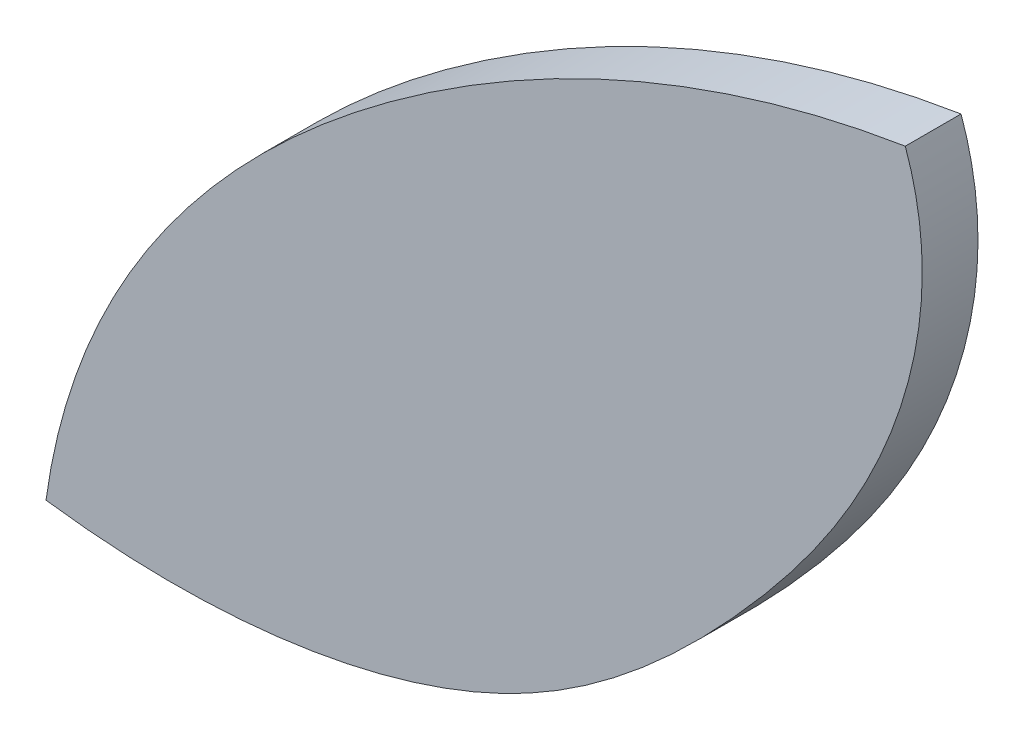
ISO-10303-21;
HEADER;
FILE_DESCRIPTION(('STEP AP214'),'2;1');
FILE_NAME('part.step','',(''),(''),'','','');
FILE_SCHEMA(('AUTOMOTIVE_DESIGN { 1 0 10303 214 1 1 1 1 }'));
ENDSEC;
DATA;
#1=APPLICATION_CONTEXT('core data for automotive mechanical design processes');
#2=APPLICATION_PROTOCOL_DEFINITION('international standard','automotive_design',2000,#1);
#3=PRODUCT_CONTEXT('',#1,'mechanical');
#4=PRODUCT('Part','Part','',(#3));
#5=PRODUCT_RELATED_PRODUCT_CATEGORY('part','',(#4));
#6=PRODUCT_DEFINITION_FORMATION('','',#4);
#7=PRODUCT_DEFINITION_CONTEXT('part definition',#1,'design');
#8=PRODUCT_DEFINITION('design','',#6,#7);
#9=PRODUCT_DEFINITION_SHAPE('','',#8);
#10=(LENGTH_UNIT() NAMED_UNIT(*) SI_UNIT(.MILLI.,.METRE.));
#11=(NAMED_UNIT(*) PLANE_ANGLE_UNIT() SI_UNIT($,.RADIAN.));
#12=(NAMED_UNIT(*) SI_UNIT($,.STERADIAN.) SOLID_ANGLE_UNIT());
#13=UNCERTAINTY_MEASURE_WITH_UNIT(LENGTH_MEASURE(1.E-05),#10,'distance_accuracy_value','');
#14=(GEOMETRIC_REPRESENTATION_CONTEXT(3) GLOBAL_UNCERTAINTY_ASSIGNED_CONTEXT((#13)) GLOBAL_UNIT_ASSIGNED_CONTEXT((#10,
#11,#12)) REPRESENTATION_CONTEXT('',''));
#15=CARTESIAN_POINT('',(0.,0.,0.));
#16=DIRECTION('',(0.,0.,1.));
#17=DIRECTION('',(1.,0.,0.));
#18=AXIS2_PLACEMENT_3D('',#15,#16,#17);
#19=CARTESIAN_POINT('',(32.8784199432722,8.94137853223743,3.));
#20=DIRECTION('',(0.,0.,1.));
#21=DIRECTION('',(1.,0.,0.));
#22=AXIS2_PLACEMENT_3D('',#19,#20,#21);
#23=PLANE('',#22);
#24=CARTESIAN_POINT('',(0.,0.,3.));
#25=CARTESIAN_POINT('',(0.329721398823703,-0.0449090701223305,3.));
#26=CARTESIAN_POINT('',(0.659892059524009,-0.0865615784518963,3.));
#27=CARTESIAN_POINT('',(1.32092617710751,-0.163347753709583,3.));
#28=CARTESIAN_POINT('',(1.65178948838158,-0.198482674058099,3.));
#29=CARTESIAN_POINT('',(2.31409814952873,-0.262242155846819,3.));
#30=CARTESIAN_POINT('',(2.64554343989444,-0.290867347822431,3.));
#31=CARTESIAN_POINT('',(3.98079719451141,-0.392989967614781,3.));
#32=CARTESIAN_POINT('',(4.98683363215821,-0.439953976317291,3.));
#33=CARTESIAN_POINT('',(6.62860333922785,-0.466978688323618,3.));
#34=CARTESIAN_POINT('',(7.2641248778094,-0.465320823546983,3.));
#35=CARTESIAN_POINT('',(8.53486832779002,-0.437240919557861,3.));
#36=CARTESIAN_POINT('',(9.17009007494591,-0.410810841291466,3.));
#37=CARTESIAN_POINT('',(10.4390792321248,-0.33250094341764,3.));
#38=CARTESIAN_POINT('',(11.0728463603468,-0.280616552192732,3.));
#39=CARTESIAN_POINT('',(12.3378171729051,-0.150571156260923,3.));
#40=CARTESIAN_POINT('',(12.9690203481776,-0.0724051690124423,3.));
#41=CARTESIAN_POINT('',(14.2236832060125,0.110586151220115,3.));
#42=CARTESIAN_POINT('',(14.8471666296933,0.215248094682774,3.));
#43=CARTESIAN_POINT('',(16.0887794337104,0.452476156408124,3.));
#44=CARTESIAN_POINT('',(16.706909186879,0.585040315011618,3.));
#45=CARTESIAN_POINT('',(17.9361156721882,0.879147257139047,3.));
#46=CARTESIAN_POINT('',(18.5471938563284,1.04068395731987,3.));
#47=CARTESIAN_POINT('',(19.7606184739435,1.39390894160029,3.));
#48=CARTESIAN_POINT('',(20.3629650467661,1.58559674393874,3.));
#49=CARTESIAN_POINT('',(21.3416517129101,1.92551777787347,3.));
#50=CARTESIAN_POINT('',(21.7212190628269,2.06451961632843,3.));
#51=CARTESIAN_POINT('',(22.4753229771006,2.35560687763814,3.));
#52=CARTESIAN_POINT('',(22.8498595018453,2.50769240344273,3.));
#53=CARTESIAN_POINT('',(23.5931553250064,2.8251686259992,3.));
#54=CARTESIAN_POINT('',(23.9619158541669,2.99055644093485,3.));
#55=CARTESIAN_POINT('',(24.6929492172135,3.33485558121848,3.));
#56=CARTESIAN_POINT('',(25.0552240255531,3.51376270120176,3.));
#57=CARTESIAN_POINT('',(25.5932348942131,3.79239619389367,3.));
#58=CARTESIAN_POINT('',(25.7716521117901,3.88697508642504,3.));
#59=CARTESIAN_POINT('',(26.1266063764534,4.07959729095361,3.));
#60=CARTESIAN_POINT('',(26.3031434283625,4.17764059406142,3.));
#61=CARTESIAN_POINT('',(26.8318246711186,4.47803013378673,3.));
#62=CARTESIAN_POINT('',(27.1810210688235,4.68559152637305,3.));
#63=CARTESIAN_POINT('',(27.8715365407776,5.1135615240998,3.));
#64=CARTESIAN_POINT('',(28.2128537530302,5.3339731234606,3.));
#65=CARTESIAN_POINT('',(28.8876384298116,5.78670154066834,3.));
#66=CARTESIAN_POINT('',(29.2211035247076,6.01902188683983,3.));
#67=CARTESIAN_POINT('',(29.8802186898772,6.49458346214352,3.));
#68=CARTESIAN_POINT('',(30.2058675796041,6.73782632526412,3.));
#69=CARTESIAN_POINT('',(30.8493934677067,7.2342305109507,3.));
#70=CARTESIAN_POINT('',(31.1672720174699,7.48738982694094,3.));
#71=CARTESIAN_POINT('',(31.9691775363834,8.14524049293005,3.));
#72=CARTESIAN_POINT('',(32.4479440839267,8.55635889109008,3.));
#73=CARTESIAN_POINT('',(33.3884438128382,9.39745750867571,3.));
#74=CARTESIAN_POINT('',(33.8501786285949,9.82743590955533,3.));
#75=CARTESIAN_POINT('',(34.758250987985,10.7039201560595,3.));
#76=CARTESIAN_POINT('',(35.2045781743001,11.1504367165036,3.));
#77=CARTESIAN_POINT('',(35.8635027900837,11.8307998582927,3.));
#78=CARTESIAN_POINT('',(36.0814863820246,12.0594656830959,3.));
#79=CARTESIAN_POINT('',(36.5140440865947,12.5200052103141,3.));
#80=CARTESIAN_POINT('',(36.7286181831514,12.7518789278415,3.));
#81=CARTESIAN_POINT('',(37.1547372817294,13.2187550100185,3.));
#82=CARTESIAN_POINT('',(37.3662795215749,13.4537598925699,3.));
#83=CARTESIAN_POINT('',(37.7862708579017,13.9265178583116,3.));
#84=CARTESIAN_POINT('',(37.9947199581027,14.1642709381964,3.));
#85=CARTESIAN_POINT('',(38.4077014535428,14.6422593603294,3.));
#86=CARTESIAN_POINT('',(38.6122413643395,14.8824881989933,3.));
#87=CARTESIAN_POINT('',(39.0175223293234,15.3661241949329,3.));
#88=CARTESIAN_POINT('',(39.2182633968506,15.6095313410426,3.));
#89=CARTESIAN_POINT('',(39.8139932083118,16.3445162701203,3.));
#90=CARTESIAN_POINT('',(40.2027629736879,16.8411735258313,3.));
#91=CARTESIAN_POINT('',(40.9600772674606,17.8487431123944,3.));
#92=CARTESIAN_POINT('',(41.3286465411886,18.3596367910262,3.));
#93=CARTESIAN_POINT('',(42.042275256388,19.3966906551616,3.));
#94=CARTESIAN_POINT('',(42.3873638183877,19.9228307327093,3.));
#95=CARTESIAN_POINT('',(43.0508188215521,20.9913658231556,3.));
#96=CARTESIAN_POINT('',(43.3692007737781,21.5337511489621,3.));
#97=CARTESIAN_POINT('',(43.8705079723053,22.4439042263714,3.));
#98=CARTESIAN_POINT('',(44.0620863313203,22.8069224287916,3.));
#99=CARTESIAN_POINT('',(44.431476875763,23.5400455984079,3.));
#100=CARTESIAN_POINT('',(44.6092851486755,23.9101525427515,3.));
#101=CARTESIAN_POINT('',(44.950155025113,24.657157692798,3.));
#102=CARTESIAN_POINT('',(45.1132148595835,25.034056706715,3.));
#103=CARTESIAN_POINT('',(45.4235970471842,25.794167375857,3.));
#104=CARTESIAN_POINT('',(45.5709238043048,26.1773772297073,3.));
#105=CARTESIAN_POINT('',(45.8487026200369,26.9498494315606,3.));
#106=CARTESIAN_POINT('',(45.9791562164101,27.3391112243835,3.));
#107=CARTESIAN_POINT('',(46.2218468892219,28.1232669273526,3.));
#108=CARTESIAN_POINT('',(46.3340838525335,28.5181608724586,3.));
#109=CARTESIAN_POINT('',(46.5921222785404,29.5200289577152,3.));
#110=CARTESIAN_POINT('',(46.7249918762546,30.1304182107155,3.));
#111=CARTESIAN_POINT('',(46.9389878095399,31.3604221743795,3.));
#112=CARTESIAN_POINT('',(47.0201030446397,31.9800388350286,3.));
#113=CARTESIAN_POINT('',(47.1234995197639,33.2220533592001,3.));
#114=CARTESIAN_POINT('',(47.1460121050631,33.8444305408228,3.));
#115=CARTESIAN_POINT('',(47.1311059724737,34.7768438809078,3.));
#116=CARTESIAN_POINT('',(47.1180326395876,35.0873909314233,3.));
#117=CARTESIAN_POINT('',(47.074929056446,35.7072854536637,3.));
#118=CARTESIAN_POINT('',(47.0449022879226,36.0166331585686,3.));
#119=CARTESIAN_POINT('',(46.9709186355546,36.6038760452394,3.));
#120=CARTESIAN_POINT('',(46.9285524893481,36.881972374944,3.));
#121=CARTESIAN_POINT('',(46.8290222077768,37.4354643069157,3.));
#122=CARTESIAN_POINT('',(46.7718607666849,37.7108603914396,3.));
#123=CARTESIAN_POINT('',(46.6422693196667,38.2589770825921,3.));
#124=CARTESIAN_POINT('',(46.5697909568622,38.5316862829677,3.));
#125=CARTESIAN_POINT('',(46.4095797774096,39.0727220970974,3.));
#126=CARTESIAN_POINT('',(46.3218398376965,39.3410466001154,3.));
#127=CARTESIAN_POINT('',(46.2264547117805,39.606646876841,3.));
#128=B_SPLINE_CURVE_WITH_KNOTS('',3,(#24,#25,#26,#27,#28,#29,#30,#31,#32,#33,#34,#35,#36,#37,
#38,#39,#40,#41,#42,#43,#44,#45,#46,#47,#48,#49,#50,#51,#52,#53,#54,#55,#56,#57,#58,#59,#60,#61,
#62,#63,#64,#65,#66,#67,#68,#69,#70,#71,#72,#73,#74,#75,#76,#77,#78,#79,#80,#81,#82,#83,#84,#85,
#86,#87,#88,#89,#90,#91,#92,#93,#94,#95,#96,#97,#98,#99,#100,#101,#102,#103,#104,#105,#106,#107,
#108,#109,#110,#111,#112,#113,#114,#115,#116,#117,#118,#119,#120,#121,#122,#123,#124,#125,#126,
#127),.UNSPECIFIED.,.F.,.F.,(4,2,2,2,2,2,2,2,2,2,2,2,2,2,2,2,2,2,2,2,2,2,2,2,2,2,2,2,2,2,2,2,2,
2,2,2,2,2,2,2,2,2,2,2,2,2,2,2,2,2,2,4),(0.,0.998292461984959,1.99639273932883,2.9943962989862,
6.01361712872947,7.9197956775692,9.82659303182036,11.7337329740299,13.6412346814472,
15.537248564064,17.4331293281464,19.3286124805797,21.2240653496288,22.4365081967404,
23.6489605849095,24.8611510104913,26.0729659076698,26.6787388206692,27.2845101794197,
28.5028645989847,29.7215040502135,30.9405066707877,32.1596922634354,33.3786324178063,
35.2711884921317,37.1635624791692,39.057184722169,40.0049149275432,40.9526495992392,
41.9011988919468,42.8497470438652,43.7962375158912,44.7427246636259,46.6344440424713,
48.523791772142,50.4107519552317,52.2966085018866,53.5277573531523,54.7592547388726,
55.9908996456361,57.2221988826421,58.4533858240996,59.6845804110584,61.5565366785186,
63.428894315378,65.2938491706299,66.2259338213185,67.1578271190929,68.0013621664436,
68.844743711167,69.6908287630049,70.5373097745734),.UNSPECIFIED.);
#129=CARTESIAN_POINT('',(0.,0.,3.));
#130=VERTEX_POINT('',#129);
#131=CARTESIAN_POINT('',(46.2264547117805,39.606646876841,3.));
#132=VERTEX_POINT('',#131);
#133=EDGE_CURVE('E24',#130,#132,#128,.T.);
#134=ORIENTED_EDGE('',*,*,#133,.T.);
#135=CARTESIAN_POINT('',(46.2264547117805,39.606646876841,3.));
#136=CARTESIAN_POINT('',(45.2380979423368,39.4477753558703,3.));
#137=CARTESIAN_POINT('',(44.2538523905631,39.2638145971802,3.));
#138=CARTESIAN_POINT('',(42.2944163568184,38.8467947062856,3.));
#139=CARTESIAN_POINT('',(41.3192399503758,38.6136693884776,3.));
#140=CARTESIAN_POINT('',(39.2031140987165,38.0525458355541,3.));
#141=CARTESIAN_POINT('',(38.0646930212978,37.7149829688989,3.));
#142=CARTESIAN_POINT('',(35.8082607836834,36.9754322350637,3.));
#143=CARTESIAN_POINT('',(34.6902623871255,36.5734055174076,3.));
#144=CARTESIAN_POINT('',(32.4782078734721,35.7075341459084,3.));
#145=CARTESIAN_POINT('',(31.3841570071182,35.2436760898886,3.));
#146=CARTESIAN_POINT('',(29.2224415359819,34.2564960980094,3.));
#147=CARTESIAN_POINT('',(28.1547932821353,33.7331383843509,3.));
#148=CARTESIAN_POINT('',(26.0494782990441,32.6298977466583,3.));
#149=CARTESIAN_POINT('',(25.0118044812559,32.050028331114,3.));
#150=CARTESIAN_POINT('',(22.9688816140578,30.8363307203649,3.));
#151=CARTESIAN_POINT('',(21.9636227381766,30.2025190936723,3.));
#152=CARTESIAN_POINT('',(20.4888669022475,29.2179135218987,3.));
#153=CARTESIAN_POINT('',(20.0062357754575,28.8866219046333,3.));
#154=CARTESIAN_POINT('',(19.0496646658213,28.211877775782,3.));
#155=CARTESIAN_POINT('',(18.5757230724857,27.8684275529323,3.));
#156=CARTESIAN_POINT('',(17.6371240225869,27.169145792449,3.));
#157=CARTESIAN_POINT('',(17.1724657740981,26.8133153180864,3.));
#158=CARTESIAN_POINT('',(16.2527540421677,26.0886244940665,3.));
#159=CARTESIAN_POINT('',(15.7977093418967,25.7197529880192,3.));
#160=CARTESIAN_POINT('',(14.8984361324613,24.9689608195061,3.));
#161=CARTESIAN_POINT('',(14.4542085354256,24.5870390630871,3.));
#162=CARTESIAN_POINT('',(13.5774481712487,23.8098244962485,3.));
#163=CARTESIAN_POINT('',(13.1449178969818,23.4145288754392,3.));
#164=CARTESIAN_POINT('',(12.0690283481005,22.3993806417666,3.));
#165=CARTESIAN_POINT('',(11.4341117651536,21.770519887174,3.));
#166=CARTESIAN_POINT('',(10.1978655200938,20.480355914255,3.));
#167=CARTESIAN_POINT('',(9.59654154455147,19.8190472385056,3.));
#168=CARTESIAN_POINT('',(8.43191331665501,18.4633939729221,3.));
#169=CARTESIAN_POINT('',(7.86861787100294,17.7690417938669,3.));
#170=CARTESIAN_POINT('',(6.78709896308569,16.349945913478,3.));
#171=CARTESIAN_POINT('',(6.2687200037777,15.6253210850277,3.));
#172=CARTESIAN_POINT('',(5.28009288340769,14.1440528309753,3.));
#173=CARTESIAN_POINT('',(4.8098363091265,13.3874150349955,3.));
#174=CARTESIAN_POINT('',(3.92294760809362,11.8436878399689,3.));
#175=CARTESIAN_POINT('',(3.50628791133244,11.0566143701046,3.));
#176=CARTESIAN_POINT('',(2.85976119237402,9.71922992065385,3.));
#177=CARTESIAN_POINT('',(2.61369019132497,9.17670242842462,3.));
#178=CARTESIAN_POINT('',(2.14927446289202,8.07997763381344,3.));
#179=CARTESIAN_POINT('',(1.93092493942214,7.52578236946533,3.));
#180=CARTESIAN_POINT('',(1.52325322452505,6.40692323175544,3.));
#181=CARTESIAN_POINT('',(1.33392574126036,5.84226128797081,3.));
#182=CARTESIAN_POINT('',(0.983882019399969,4.69900762511437,3.));
#183=CARTESIAN_POINT('',(0.823416174200643,4.12033920608469,3.));
#184=CARTESIAN_POINT('',(0.53383610665214,2.95500845590577,3.));
#185=CARTESIAN_POINT('',(0.40473031100924,2.36834402078627,3.));
#186=CARTESIAN_POINT('',(0.234986129548311,1.48360811657343,3.));
#187=CARTESIAN_POINT('',(0.18237439527519,1.18778818285362,3.));
#188=CARTESIAN_POINT('',(0.0851689009007837,0.594832968071263,3.));
#189=CARTESIAN_POINT('',(0.0405751638307364,0.297697683232959,3.));
#190=CARTESIAN_POINT('',(0.,0.,3.));
#191=B_SPLINE_CURVE_WITH_KNOTS('',3,(#135,#136,#137,#138,#139,#140,#141,#142,#143,#144,#145,
#146,#147,#148,#149,#150,#151,#152,#153,#154,#155,#156,#157,#158,#159,#160,#161,#162,#163,#164,
#165,#166,#167,#168,#169,#170,#171,#172,#173,#174,#175,#176,#177,#178,#179,#180,#181,#182,#183,
#184,#185,#186,#187,#188,#189,#190),.UNSPECIFIED.,.F.,.F.,(4,2,2,2,2,2,2,2,2,2,2,2,2,2,2,2,2,2,
2,2,2,2,2,2,2,2,2,4),(0.,3.0026824877662,6.00943330532942,9.56966029290925,13.1320410458126,
16.6951952176598,20.2605034001031,23.8249614162112,27.3883285225083,29.1443589140129,
30.9000604898725,32.6556116486969,34.4127028318652,36.1699416684446,37.9275520939946,
40.6072702045681,43.2874405728718,45.9682295047778,48.6393324131179,51.3099675327975,
53.9792233481533,55.7657136768365,57.5518945028545,59.3377492507997,61.1384196920608,
62.9395734545168,63.8408644767897,64.7421580879282),.UNSPECIFIED.);
#192=EDGE_CURVE('E54',#132,#130,#191,.T.);
#193=ORIENTED_EDGE('',*,*,#192,.T.);
#194=EDGE_LOOP('',(#134,#193));
#195=FACE_BOUND('',#194,.T.);
#196=ADVANCED_FACE('F17',(#195),#23,.T.);
#197=CARTESIAN_POINT('',(0.,0.,3.));
#198=CARTESIAN_POINT('',(0.,0.,0.));
#199=CARTESIAN_POINT('',(8.68950239891513,-1.18362191208477,3.));
#200=CARTESIAN_POINT('',(8.68950239891513,-1.18362191208477,0.));
#201=CARTESIAN_POINT('',(23.7506501852725,0.330471541162859,3.));
#202=CARTESIAN_POINT('',(23.7506501852725,0.330471541162859,0.));
#203=CARTESIAN_POINT('',(37.6438343672278,13.058756394492,3.));
#204=CARTESIAN_POINT('',(37.6438343672278,13.058756394492,0.));
#205=CARTESIAN_POINT('',(46.2538933961237,24.7966842191075,3.));
#206=CARTESIAN_POINT('',(46.2538933961237,24.7966842191075,0.));
#207=CARTESIAN_POINT('',(47.934931795003,34.8478222939048,3.));
#208=CARTESIAN_POINT('',(47.934931795003,34.8478222939048,0.));
#209=CARTESIAN_POINT('',(46.2264547117805,39.606646876841,3.));
#210=CARTESIAN_POINT('',(46.2264547117805,39.606646876841,0.));
#211=B_SPLINE_SURFACE_WITH_KNOTS('',3,1,((#197,#198),(#199,#200),(#201,#202),(#203,#204),(#205,
#206),(#207,#208),(#209,#210)),.UNSPECIFIED.,.F.,.F.,.F.,(4,1,1,1,4),(2,2),(0.,
0.383387059858794,0.59213823907144,0.788086285039639,1.),(0.,1.),.UNSPECIFIED.);
#212=DIRECTION('',(0.,0.,-1.));
#213=VECTOR('',#212,1.);
#214=CARTESIAN_POINT('',(0.,0.,1.5));
#215=LINE('',#214,#213);
#216=CARTESIAN_POINT('',(0.,0.,0.));
#217=VERTEX_POINT('',#216);
#218=EDGE_CURVE('E55',#130,#217,#215,.T.);
#219=CARTESIAN_POINT('',(0.,0.,0.));
#220=CARTESIAN_POINT('',(0.329721398823703,-0.0449090701223305,0.));
#221=CARTESIAN_POINT('',(0.659892059524009,-0.0865615784518963,0.));
#222=CARTESIAN_POINT('',(1.32092617710751,-0.163347753709583,0.));
#223=CARTESIAN_POINT('',(1.65178948838158,-0.198482674058099,0.));
#224=CARTESIAN_POINT('',(2.31409814952873,-0.262242155846819,0.));
#225=CARTESIAN_POINT('',(2.64554343989444,-0.290867347822431,0.));
#226=CARTESIAN_POINT('',(3.98079719451141,-0.392989967614781,0.));
#227=CARTESIAN_POINT('',(4.98683363215821,-0.439953976317291,0.));
#228=CARTESIAN_POINT('',(6.62860333922785,-0.466978688323618,0.));
#229=CARTESIAN_POINT('',(7.2641248778094,-0.465320823546983,0.));
#230=CARTESIAN_POINT('',(8.53486832779002,-0.437240919557861,0.));
#231=CARTESIAN_POINT('',(9.17009007494591,-0.410810841291466,0.));
#232=CARTESIAN_POINT('',(10.4390792321248,-0.33250094341764,0.));
#233=CARTESIAN_POINT('',(11.0728463603468,-0.280616552192732,0.));
#234=CARTESIAN_POINT('',(12.3378171729051,-0.150571156260923,0.));
#235=CARTESIAN_POINT('',(12.9690203481776,-0.0724051690124421,0.));
#236=CARTESIAN_POINT('',(14.2236832060125,0.110586151220115,0.));
#237=CARTESIAN_POINT('',(14.8471666296933,0.215248094682773,0.));
#238=CARTESIAN_POINT('',(16.0887794337104,0.452476156408123,0.));
#239=CARTESIAN_POINT('',(16.706909186879,0.585040315011617,0.));
#240=CARTESIAN_POINT('',(17.9361156721882,0.879147257139047,0.));
#241=CARTESIAN_POINT('',(18.5471938563284,1.04068395731987,0.));
#242=CARTESIAN_POINT('',(19.7606184739435,1.39390894160029,0.));
#243=CARTESIAN_POINT('',(20.3629650467661,1.58559674393874,0.));
#244=CARTESIAN_POINT('',(21.3416517129101,1.92551777787347,0.));
#245=CARTESIAN_POINT('',(21.7212190628269,2.06451961632843,0.));
#246=CARTESIAN_POINT('',(22.4753229771006,2.35560687763814,0.));
#247=CARTESIAN_POINT('',(22.8498595018453,2.50769240344272,0.));
#248=CARTESIAN_POINT('',(23.5931553250064,2.8251686259992,0.));
#249=CARTESIAN_POINT('',(23.9619158541669,2.99055644093484,0.));
#250=CARTESIAN_POINT('',(24.6929492172135,3.33485558121848,0.));
#251=CARTESIAN_POINT('',(25.0552240255531,3.51376270120176,0.));
#252=CARTESIAN_POINT('',(25.5932348942131,3.79239619389367,0.));
#253=CARTESIAN_POINT('',(25.7716521117901,3.88697508642504,0.));
#254=CARTESIAN_POINT('',(26.1266063764534,4.0795972909536,0.));
#255=CARTESIAN_POINT('',(26.3031434283625,4.17764059406142,0.));
#256=CARTESIAN_POINT('',(26.8318246711186,4.47803013378673,0.));
#257=CARTESIAN_POINT('',(27.1810210688235,4.68559152637305,0.));
#258=CARTESIAN_POINT('',(27.8715365407776,5.1135615240998,0.));
#259=CARTESIAN_POINT('',(28.2128537530302,5.3339731234606,0.));
#260=CARTESIAN_POINT('',(28.8876384298116,5.78670154066834,0.));
#261=CARTESIAN_POINT('',(29.2211035247076,6.01902188683983,0.));
#262=CARTESIAN_POINT('',(29.8802186898772,6.49458346214352,0.));
#263=CARTESIAN_POINT('',(30.2058675796041,6.73782632526412,0.));
#264=CARTESIAN_POINT('',(30.8493934677067,7.2342305109507,0.));
#265=CARTESIAN_POINT('',(31.1672720174699,7.48738982694094,0.));
#266=CARTESIAN_POINT('',(31.9691775363834,8.14524049293005,0.));
#267=CARTESIAN_POINT('',(32.4479440839267,8.55635889109008,0.));
#268=CARTESIAN_POINT('',(33.3884438128382,9.39745750867571,0.));
#269=CARTESIAN_POINT('',(33.8501786285949,9.82743590955532,0.));
#270=CARTESIAN_POINT('',(34.758250987985,10.7039201560595,0.));
#271=CARTESIAN_POINT('',(35.2045781743001,11.1504367165036,0.));
#272=CARTESIAN_POINT('',(35.8635027900837,11.8307998582927,0.));
#273=CARTESIAN_POINT('',(36.0814863820246,12.0594656830959,0.));
#274=CARTESIAN_POINT('',(36.5140440865947,12.5200052103141,0.));
#275=CARTESIAN_POINT('',(36.7286181831514,12.7518789278415,0.));
#276=CARTESIAN_POINT('',(37.1547372817294,13.2187550100185,0.));
#277=CARTESIAN_POINT('',(37.3662795215749,13.4537598925699,0.));
#278=CARTESIAN_POINT('',(37.7862708579017,13.9265178583116,0.));
#279=CARTESIAN_POINT('',(37.9947199581027,14.1642709381964,0.));
#280=CARTESIAN_POINT('',(38.4077014535428,14.6422593603294,0.));
#281=CARTESIAN_POINT('',(38.6122413643395,14.8824881989933,0.));
#282=CARTESIAN_POINT('',(39.0175223293234,15.3661241949329,0.));
#283=CARTESIAN_POINT('',(39.2182633968506,15.6095313410426,0.));
#284=CARTESIAN_POINT('',(39.8139932083118,16.3445162701203,0.));
#285=CARTESIAN_POINT('',(40.2027629736879,16.8411735258313,0.));
#286=CARTESIAN_POINT('',(40.9600772674606,17.8487431123944,0.));
#287=CARTESIAN_POINT('',(41.3286465411886,18.3596367910262,0.));
#288=CARTESIAN_POINT('',(42.042275256388,19.3966906551616,0.));
#289=CARTESIAN_POINT('',(42.3873638183877,19.9228307327093,0.));
#290=CARTESIAN_POINT('',(43.0508188215521,20.9913658231556,0.));
#291=CARTESIAN_POINT('',(43.3692007737781,21.5337511489621,0.));
#292=CARTESIAN_POINT('',(43.8705079723053,22.4439042263714,0.));
#293=CARTESIAN_POINT('',(44.0620863313203,22.8069224287916,0.));
#294=CARTESIAN_POINT('',(44.431476875763,23.5400455984079,0.));
#295=CARTESIAN_POINT('',(44.6092851486755,23.9101525427515,0.));
#296=CARTESIAN_POINT('',(44.950155025113,24.657157692798,0.));
#297=CARTESIAN_POINT('',(45.1132148595835,25.034056706715,0.));
#298=CARTESIAN_POINT('',(45.4235970471842,25.794167375857,0.));
#299=CARTESIAN_POINT('',(45.5709238043048,26.1773772297074,0.));
#300=CARTESIAN_POINT('',(45.8487026200369,26.9498494315606,0.));
#301=CARTESIAN_POINT('',(45.9791562164101,27.3391112243835,0.));
#302=CARTESIAN_POINT('',(46.2218468892219,28.1232669273526,0.));
#303=CARTESIAN_POINT('',(46.3340838525335,28.5181608724586,0.));
#304=CARTESIAN_POINT('',(46.5921222785404,29.5200289577152,0.));
#305=CARTESIAN_POINT('',(46.7249918762546,30.1304182107155,0.));
#306=CARTESIAN_POINT('',(46.9389878095399,31.3604221743795,0.));
#307=CARTESIAN_POINT('',(47.0201030446397,31.9800388350286,0.));
#308=CARTESIAN_POINT('',(47.1234995197639,33.2220533592001,0.));
#309=CARTESIAN_POINT('',(47.1460121050631,33.8444305408228,0.));
#310=CARTESIAN_POINT('',(47.1311059724737,34.7768438809078,0.));
#311=CARTESIAN_POINT('',(47.1180326395876,35.0873909314233,0.));
#312=CARTESIAN_POINT('',(47.074929056446,35.7072854536637,0.));
#313=CARTESIAN_POINT('',(47.0449022879226,36.0166331585686,0.));
#314=CARTESIAN_POINT('',(46.9709186355546,36.6038760452394,0.));
#315=CARTESIAN_POINT('',(46.9285524893481,36.881972374944,0.));
#316=CARTESIAN_POINT('',(46.8290222077768,37.4354643069157,0.));
#317=CARTESIAN_POINT('',(46.7718607666849,37.7108603914396,0.));
#318=CARTESIAN_POINT('',(46.6422693196667,38.2589770825921,0.));
#319=CARTESIAN_POINT('',(46.5697909568622,38.5316862829677,0.));
#320=CARTESIAN_POINT('',(46.4095797774096,39.0727220970974,0.));
#321=CARTESIAN_POINT('',(46.3218398376965,39.3410466001154,0.));
#322=CARTESIAN_POINT('',(46.2264547117805,39.606646876841,0.));
#323=B_SPLINE_CURVE_WITH_KNOTS('',3,(#219,#220,#221,#222,#223,#224,#225,#226,#227,#228,#229,
#230,#231,#232,#233,#234,#235,#236,#237,#238,#239,#240,#241,#242,#243,#244,#245,#246,#247,#248,
#249,#250,#251,#252,#253,#254,#255,#256,#257,#258,#259,#260,#261,#262,#263,#264,#265,#266,#267,
#268,#269,#270,#271,#272,#273,#274,#275,#276,#277,#278,#279,#280,#281,#282,#283,#284,#285,#286,
#287,#288,#289,#290,#291,#292,#293,#294,#295,#296,#297,#298,#299,#300,#301,#302,#303,#304,#305,
#306,#307,#308,#309,#310,#311,#312,#313,#314,#315,#316,#317,#318,#319,#320,#321,#322),
.UNSPECIFIED.,.F.,.F.,(4,2,2,2,2,2,2,2,2,2,2,2,2,2,2,2,2,2,2,2,2,2,2,2,2,2,2,2,2,2,2,2,2,2,2,2,
2,2,2,2,2,2,2,2,2,2,2,2,2,2,2,4),(0.,0.998292461984959,1.99639273932883,2.9943962989862,
6.01361712872947,7.9197956775692,9.82659303182036,11.7337329740299,13.6412346814472,
15.537248564064,17.4331293281464,19.3286124805797,21.2240653496288,22.4365081967404,
23.6489605849095,24.8611510104913,26.0729659076698,26.6787388206692,27.2845101794197,
28.5028645989847,29.7215040502135,30.9405066707877,32.1596922634354,33.3786324178063,
35.2711884921317,37.1635624791692,39.057184722169,40.0049149275432,40.9526495992391,
41.9011988919468,42.8497470438652,43.7962375158912,44.7427246636259,46.6344440424713,
48.523791772142,50.4107519552317,52.2966085018866,53.5277573531523,54.7592547388726,
55.990899645636,57.2221988826421,58.4533858240996,59.6845804110584,61.5565366785186,
63.428894315378,65.2938491706299,66.2259338213185,67.1578271190929,68.0013621664436,
68.844743711167,69.6908287630049,70.5373097745734),.UNSPECIFIED.);
#324=CARTESIAN_POINT('',(46.2264547117805,39.606646876841,0.));
#325=VERTEX_POINT('',#324);
#326=EDGE_CURVE('E34',#217,#325,#323,.T.);
#327=DIRECTION('',(0.,0.,1.));
#328=VECTOR('',#327,1.);
#329=CARTESIAN_POINT('',(46.2264547117805,39.606646876841,1.5));
#330=LINE('',#329,#328);
#331=EDGE_CURVE('E42',#325,#132,#330,.T.);
#332=ORIENTED_EDGE('',*,*,#133,.F.);
#333=ORIENTED_EDGE('',*,*,#218,.T.);
#334=ORIENTED_EDGE('',*,*,#326,.T.);
#335=ORIENTED_EDGE('',*,*,#331,.T.);
#336=EDGE_LOOP('',(#332,#333,#334,#335));
#337=FACE_BOUND('',#336,.T.);
#338=ADVANCED_FACE('F57',(#337),#211,.F.);
#339=CARTESIAN_POINT('',(46.2264547117805,39.606646876841,3.));
#340=CARTESIAN_POINT('',(46.2264547117805,39.606646876841,0.));
#341=CARTESIAN_POINT('',(36.5777257956866,38.0554638231151,3.));
#342=CARTESIAN_POINT('',(36.5777257956866,38.0554638231151,0.));
#343=CARTESIAN_POINT('',(16.3250946413144,29.4159950832889,3.));
#344=CARTESIAN_POINT('',(16.3250946413144,29.4159950832889,0.));
#345=CARTESIAN_POINT('',(1.64354972929849,12.0580243164943,3.));
#346=CARTESIAN_POINT('',(1.64354972929849,12.0580243164943,0.));
#347=CARTESIAN_POINT('',(0.,0.,3.));
#348=CARTESIAN_POINT('',(0.,0.,0.));
#349=B_SPLINE_SURFACE_WITH_KNOTS('',3,1,((#339,#340),(#341,#342),(#343,#344),(#345,#346),(#347,
#348)),.UNSPECIFIED.,.F.,.F.,.F.,(4,1,4),(2,2),(0.,0.455077965932473,1.),(0.,1.),.UNSPECIFIED.);
#350=CARTESIAN_POINT('',(46.2264547117805,39.606646876841,0.));
#351=CARTESIAN_POINT('',(45.2380979423368,39.4477753558703,0.));
#352=CARTESIAN_POINT('',(44.2538523905631,39.2638145971802,0.));
#353=CARTESIAN_POINT('',(42.2944163568184,38.8467947062856,0.));
#354=CARTESIAN_POINT('',(41.3192399503759,38.6136693884776,0.));
#355=CARTESIAN_POINT('',(39.2031140987165,38.0525458355541,0.));
#356=CARTESIAN_POINT('',(38.0646930212978,37.7149829688989,0.));
#357=CARTESIAN_POINT('',(35.8082607836834,36.9754322350637,0.));
#358=CARTESIAN_POINT('',(34.6902623871255,36.5734055174076,0.));
#359=CARTESIAN_POINT('',(32.4782078734721,35.7075341459084,0.));
#360=CARTESIAN_POINT('',(31.3841570071182,35.2436760898886,0.));
#361=CARTESIAN_POINT('',(29.2224415359819,34.2564960980094,0.));
#362=CARTESIAN_POINT('',(28.1547932821353,33.7331383843509,0.));
#363=CARTESIAN_POINT('',(26.0494782990441,32.6298977466583,0.));
#364=CARTESIAN_POINT('',(25.0118044812559,32.050028331114,0.));
#365=CARTESIAN_POINT('',(22.9688816140578,30.8363307203649,0.));
#366=CARTESIAN_POINT('',(21.9636227381766,30.2025190936723,0.));
#367=CARTESIAN_POINT('',(20.4888669022475,29.2179135218987,0.));
#368=CARTESIAN_POINT('',(20.0062357754575,28.8866219046333,0.));
#369=CARTESIAN_POINT('',(19.0496646658213,28.211877775782,0.));
#370=CARTESIAN_POINT('',(18.5757230724857,27.8684275529323,0.));
#371=CARTESIAN_POINT('',(17.6371240225869,27.169145792449,0.));
#372=CARTESIAN_POINT('',(17.1724657740981,26.8133153180864,0.));
#373=CARTESIAN_POINT('',(16.2527540421677,26.0886244940665,0.));
#374=CARTESIAN_POINT('',(15.7977093418967,25.7197529880191,0.));
#375=CARTESIAN_POINT('',(14.8984361324613,24.9689608195061,0.));
#376=CARTESIAN_POINT('',(14.4542085354256,24.5870390630871,0.));
#377=CARTESIAN_POINT('',(13.5774481712486,23.8098244962485,0.));
#378=CARTESIAN_POINT('',(13.1449178969818,23.4145288754392,0.));
#379=CARTESIAN_POINT('',(12.0690283481005,22.3993806417666,0.));
#380=CARTESIAN_POINT('',(11.4341117651536,21.770519887174,0.));
#381=CARTESIAN_POINT('',(10.1978655200938,20.480355914255,0.));
#382=CARTESIAN_POINT('',(9.59654154455145,19.8190472385056,0.));
#383=CARTESIAN_POINT('',(8.431913316655,18.4633939729221,0.));
#384=CARTESIAN_POINT('',(7.86861787100293,17.7690417938669,0.));
#385=CARTESIAN_POINT('',(6.78709896308569,16.349945913478,0.));
#386=CARTESIAN_POINT('',(6.2687200037777,15.6253210850277,0.));
#387=CARTESIAN_POINT('',(5.28009288340768,14.1440528309753,0.));
#388=CARTESIAN_POINT('',(4.80983630912649,13.3874150349955,0.));
#389=CARTESIAN_POINT('',(3.92294760809362,11.8436878399689,0.));
#390=CARTESIAN_POINT('',(3.50628791133243,11.0566143701046,0.));
#391=CARTESIAN_POINT('',(2.85976119237402,9.71922992065384,0.));
#392=CARTESIAN_POINT('',(2.61369019132497,9.17670242842461,0.));
#393=CARTESIAN_POINT('',(2.14927446289202,8.07997763381343,0.));
#394=CARTESIAN_POINT('',(1.93092493942213,7.52578236946533,0.));
#395=CARTESIAN_POINT('',(1.52325322452505,6.40692323175544,0.));
#396=CARTESIAN_POINT('',(1.33392574126036,5.84226128797081,0.));
#397=CARTESIAN_POINT('',(0.983882019399968,4.69900762511436,0.));
#398=CARTESIAN_POINT('',(0.823416174200642,4.12033920608469,0.));
#399=CARTESIAN_POINT('',(0.53383610665214,2.95500845590576,0.));
#400=CARTESIAN_POINT('',(0.40473031100924,2.36834402078627,0.));
#401=CARTESIAN_POINT('',(0.23498612954831,1.48360811657343,0.));
#402=CARTESIAN_POINT('',(0.18237439527519,1.18778818285362,0.));
#403=CARTESIAN_POINT('',(0.0851689009007836,0.594832968071263,0.));
#404=CARTESIAN_POINT('',(0.0405751638307364,0.297697683232959,0.));
#405=CARTESIAN_POINT('',(0.,0.,0.));
#406=B_SPLINE_CURVE_WITH_KNOTS('',3,(#350,#351,#352,#353,#354,#355,#356,#357,#358,#359,#360,
#361,#362,#363,#364,#365,#366,#367,#368,#369,#370,#371,#372,#373,#374,#375,#376,#377,#378,#379,
#380,#381,#382,#383,#384,#385,#386,#387,#388,#389,#390,#391,#392,#393,#394,#395,#396,#397,#398,
#399,#400,#401,#402,#403,#404,#405),.UNSPECIFIED.,.F.,.F.,(4,2,2,2,2,2,2,2,2,2,2,2,2,2,2,2,2,2,
2,2,2,2,2,2,2,2,2,4),(0.,3.0026824877662,6.00943330532942,9.56966029290925,13.1320410458126,
16.6951952176598,20.2605034001031,23.8249614162112,27.3883285225083,29.1443589140129,
30.9000604898725,32.6556116486969,34.4127028318652,36.1699416684446,37.9275520939946,
40.6072702045682,43.2874405728718,45.9682295047778,48.6393324131179,51.3099675327975,
53.9792233481533,55.7657136768365,57.5518945028545,59.3377492507997,61.1384196920608,
62.9395734545168,63.8408644767897,64.7421580879282),.UNSPECIFIED.);
#407=EDGE_CURVE('E11',#325,#217,#406,.T.);
#408=ORIENTED_EDGE('',*,*,#192,.F.);
#409=ORIENTED_EDGE('',*,*,#331,.F.);
#410=ORIENTED_EDGE('',*,*,#407,.T.);
#411=ORIENTED_EDGE('',*,*,#218,.F.);
#412=EDGE_LOOP('',(#408,#409,#410,#411));
#413=FACE_BOUND('',#412,.T.);
#414=ADVANCED_FACE('F19',(#413),#349,.F.);
#415=CARTESIAN_POINT('',(32.8784199432722,8.94137853223743,0.));
#416=DIRECTION('',(0.,0.,1.));
#417=DIRECTION('',(1.,0.,0.));
#418=AXIS2_PLACEMENT_3D('',#415,#416,#417);
#419=PLANE('',#418);
#420=ORIENTED_EDGE('',*,*,#326,.F.);
#421=ORIENTED_EDGE('',*,*,#407,.F.);
#422=EDGE_LOOP('',(#420,#421));
#423=FACE_BOUND('',#422,.T.);
#424=ADVANCED_FACE('F68',(#423),#419,.F.);
#425=CLOSED_SHELL('',(#196,#338,#414,#424));
#426=MANIFOLD_SOLID_BREP('B1',#425);
#427=ADVANCED_BREP_SHAPE_REPRESENTATION('',(#18,#426),#14);
#428=SHAPE_DEFINITION_REPRESENTATION(#9,#427);
ENDSEC;
END-ISO-10303-21;
